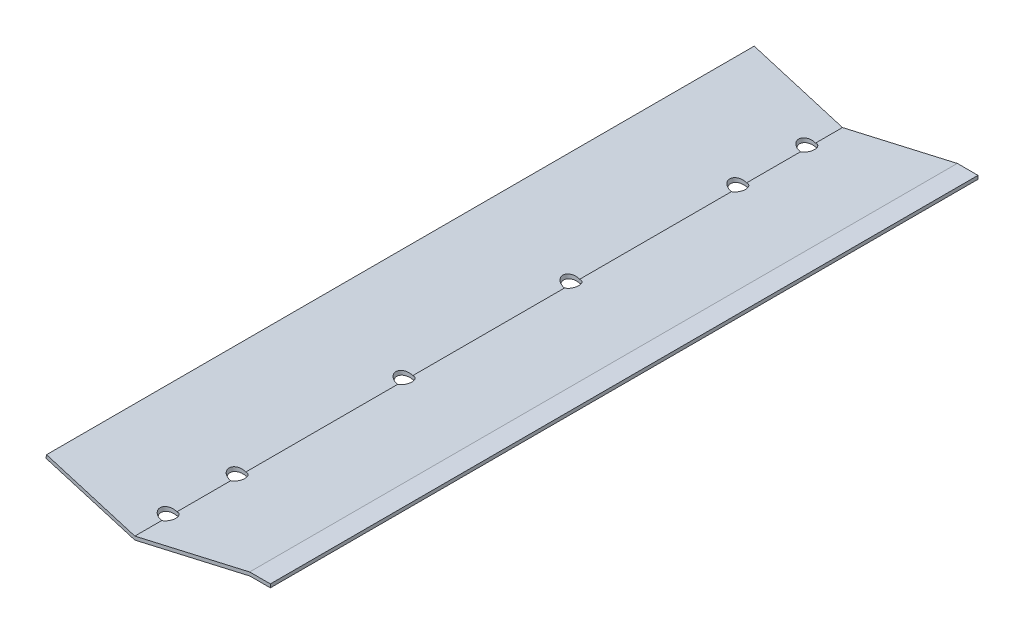
ISO-10303-21;
HEADER;
FILE_DESCRIPTION(('STEP AP214'),'2;1');
FILE_NAME('part.step','',(''),(''),'','','');
FILE_SCHEMA(('AUTOMOTIVE_DESIGN { 1 0 10303 214 1 1 1 1 }'));
ENDSEC;
DATA;
#1=APPLICATION_CONTEXT('core data for automotive mechanical design processes');
#2=APPLICATION_PROTOCOL_DEFINITION('international standard','automotive_design',2000,#1);
#3=PRODUCT_CONTEXT('',#1,'mechanical');
#4=PRODUCT('Part','Part','',(#3));
#5=PRODUCT_RELATED_PRODUCT_CATEGORY('part','',(#4));
#6=PRODUCT_DEFINITION_FORMATION('','',#4);
#7=PRODUCT_DEFINITION_CONTEXT('part definition',#1,'design');
#8=PRODUCT_DEFINITION('design','',#6,#7);
#9=PRODUCT_DEFINITION_SHAPE('','',#8);
#10=(LENGTH_UNIT() NAMED_UNIT(*) SI_UNIT(.MILLI.,.METRE.));
#11=(NAMED_UNIT(*) PLANE_ANGLE_UNIT() SI_UNIT($,.RADIAN.));
#12=(NAMED_UNIT(*) SI_UNIT($,.STERADIAN.) SOLID_ANGLE_UNIT());
#13=UNCERTAINTY_MEASURE_WITH_UNIT(LENGTH_MEASURE(1.E-05),#10,'distance_accuracy_value','');
#14=(GEOMETRIC_REPRESENTATION_CONTEXT(3) GLOBAL_UNCERTAINTY_ASSIGNED_CONTEXT((#13)) GLOBAL_UNIT_ASSIGNED_CONTEXT((#10,
#11,#12)) REPRESENTATION_CONTEXT('',''));
#15=CARTESIAN_POINT('',(0.,0.,0.));
#16=DIRECTION('',(0.,0.,1.));
#17=DIRECTION('',(1.,0.,0.));
#18=AXIS2_PLACEMENT_3D('',#15,#16,#17);
#19=CARTESIAN_POINT('',(-11425.3816093316,7351.86746050751,1026.));
#20=DIRECTION('',(-0.22352913665319,0.974697247901665,0.));
#21=DIRECTION('',(-0.974697247901665,-0.22352913665319,0.));
#22=AXIS2_PLACEMENT_3D('',#19,#20,#21);
#23=PLANE('',#22);
#24=DIRECTION('',(0.,0.,-1.));
#25=VECTOR('',#24,1.);
#26=CARTESIAN_POINT('',(-11592.2884405251,7313.59040580309,1026.));
#27=LINE('',#26,#25);
#28=CARTESIAN_POINT('',(-11592.2884405251,7313.59040580309,139.000000000003));
#29=VERTEX_POINT('',#28);
#30=CARTESIAN_POINT('',(-11592.2884405251,7313.59040580309,60.9999999999983));
#31=VERTEX_POINT('',#30);
#32=EDGE_CURVE('E235',#29,#31,#27,.T.);
#33=ORIENTED_EDGE('',*,*,#32,.T.);
#34=CARTESIAN_POINT('',(-11592.2884405251,7313.59040580309,50.));
#35=DIRECTION('',(-0.22352913665319,0.974697247901665,0.));
#36=DIRECTION('',(-0.974697247901665,-0.22352913665319,0.));
#37=AXIS2_PLACEMENT_3D('',#34,#35,#36);
#38=CIRCLE('',#37,10.9999999999978);
#39=CARTESIAN_POINT('',(-11592.2884405251,7313.59040580309,39.0000000000027));
#40=VERTEX_POINT('',#39);
#41=EDGE_CURVE('E427',#31,#40,#38,.T.);
#42=ORIENTED_EDGE('',*,*,#41,.T.);
#43=CARTESIAN_POINT('',(-11592.2884405251,7313.59040580309,0.));
#44=VERTEX_POINT('',#43);
#45=EDGE_CURVE('E196',#40,#44,#27,.T.);
#46=ORIENTED_EDGE('',*,*,#45,.T.);
#47=DIRECTION('',(0.974697247901665,0.22352913665319,0.));
#48=VECTOR('',#47,1.);
#49=CARTESIAN_POINT('',(-11425.3816093316,7351.86746050751,0.));
#50=LINE('',#49,#48);
#51=CARTESIAN_POINT('',(-11425.3816093316,7351.86746050751,0.));
#52=VERTEX_POINT('',#51);
#53=EDGE_CURVE('E255',#44,#52,#50,.T.);
#54=ORIENTED_EDGE('',*,*,#53,.T.);
#55=DIRECTION('',(0.,0.,-1.));
#56=VECTOR('',#55,1.);
#57=CARTESIAN_POINT('',(-11425.3816093316,7351.86746050751,1026.));
#58=LINE('',#57,#56);
#59=CARTESIAN_POINT('',(-11425.3816093316,7351.86746050751,1026.));
#60=VERTEX_POINT('',#59);
#61=EDGE_CURVE('E178',#60,#52,#58,.T.);
#62=ORIENTED_EDGE('',*,*,#61,.F.);
#63=DIRECTION('',(0.974697247901665,0.22352913665319,0.));
#64=VECTOR('',#63,1.);
#65=CARTESIAN_POINT('',(-11425.3816093316,7351.86746050751,1026.));
#66=LINE('',#65,#64);
#67=CARTESIAN_POINT('',(-11592.2884405251,7313.59040580309,1026.));
#68=VERTEX_POINT('',#67);
#69=EDGE_CURVE('E271',#68,#60,#66,.T.);
#70=ORIENTED_EDGE('',*,*,#69,.F.);
#71=CARTESIAN_POINT('',(-11592.2884405251,7313.59040580309,986.999999999998));
#72=VERTEX_POINT('',#71);
#73=EDGE_CURVE('E186',#68,#72,#27,.T.);
#74=ORIENTED_EDGE('',*,*,#73,.T.);
#75=CARTESIAN_POINT('',(-11592.2884405251,7313.59040580309,976.));
#76=DIRECTION('',(-0.22352913665319,0.974697247901665,0.));
#77=DIRECTION('',(-0.974697247901665,-0.22352913665319,0.));
#78=AXIS2_PLACEMENT_3D('',#75,#76,#77);
#79=CIRCLE('',#78,10.9999999999978);
#80=CARTESIAN_POINT('',(-11592.2884405251,7313.59040580309,965.000000000002));
#81=VERTEX_POINT('',#80);
#82=EDGE_CURVE('E172',#72,#81,#79,.T.);
#83=ORIENTED_EDGE('',*,*,#82,.T.);
#84=CARTESIAN_POINT('',(-11592.2884405251,7313.59040580309,886.999999999998));
#85=VERTEX_POINT('',#84);
#86=EDGE_CURVE('E184',#81,#85,#27,.T.);
#87=ORIENTED_EDGE('',*,*,#86,.T.);
#88=CARTESIAN_POINT('',(-11592.2884405251,7313.59040580309,876.));
#89=DIRECTION('',(-0.22352913665319,0.974697247901665,0.));
#90=DIRECTION('',(-0.974697247901665,-0.22352913665319,0.));
#91=AXIS2_PLACEMENT_3D('',#88,#89,#90);
#92=CIRCLE('',#91,10.9999999999978);
#93=CARTESIAN_POINT('',(-11592.2884405251,7313.59040580309,865.000000000002));
#94=VERTEX_POINT('',#93);
#95=EDGE_CURVE('E451',#85,#94,#92,.T.);
#96=ORIENTED_EDGE('',*,*,#95,.T.);
#97=CARTESIAN_POINT('',(-11592.2884405251,7313.59040580309,644.999999999998));
#98=VERTEX_POINT('',#97);
#99=EDGE_CURVE('E193',#94,#98,#27,.T.);
#100=ORIENTED_EDGE('',*,*,#99,.T.);
#101=CARTESIAN_POINT('',(-11592.2884405251,7313.59040580309,634.));
#102=DIRECTION('',(-0.22352913665319,0.974697247901665,0.));
#103=DIRECTION('',(-0.974697247901665,-0.22352913665319,0.));
#104=AXIS2_PLACEMENT_3D('',#101,#102,#103);
#105=CIRCLE('',#104,10.9999999999978);
#106=CARTESIAN_POINT('',(-11592.2884405251,7313.59040580309,623.000000000002));
#107=VERTEX_POINT('',#106);
#108=EDGE_CURVE('E445',#98,#107,#105,.T.);
#109=ORIENTED_EDGE('',*,*,#108,.T.);
#110=CARTESIAN_POINT('',(-11592.2884405251,7313.59040580309,402.999999999998));
#111=VERTEX_POINT('',#110);
#112=EDGE_CURVE('E198',#107,#111,#27,.T.);
#113=ORIENTED_EDGE('',*,*,#112,.T.);
#114=CARTESIAN_POINT('',(-11592.2884405251,7313.59040580309,392.));
#115=DIRECTION('',(-0.22352913665319,0.974697247901665,0.));
#116=DIRECTION('',(-0.974697247901665,-0.22352913665319,0.));
#117=AXIS2_PLACEMENT_3D('',#114,#115,#116);
#118=CIRCLE('',#117,10.9999999999978);
#119=CARTESIAN_POINT('',(-11592.2884405251,7313.59040580309,381.000000000003));
#120=VERTEX_POINT('',#119);
#121=EDGE_CURVE('E241',#111,#120,#118,.T.);
#122=ORIENTED_EDGE('',*,*,#121,.T.);
#123=CARTESIAN_POINT('',(-11592.2884405251,7313.59040580309,160.999999999998));
#124=VERTEX_POINT('',#123);
#125=EDGE_CURVE('E234',#120,#124,#27,.T.);
#126=ORIENTED_EDGE('',*,*,#125,.T.);
#127=CARTESIAN_POINT('',(-11592.2884405251,7313.59040580309,150.));
#128=DIRECTION('',(-0.22352913665319,0.974697247901665,0.));
#129=DIRECTION('',(-0.974697247901665,-0.22352913665319,0.));
#130=AXIS2_PLACEMENT_3D('',#127,#128,#129);
#131=CIRCLE('',#130,10.9999999999978);
#132=EDGE_CURVE('E239',#124,#29,#131,.T.);
#133=ORIENTED_EDGE('',*,*,#132,.T.);
#134=EDGE_LOOP('',(#33,#42,#46,#54,#62,#70,#74,#83,#87,#96,#100,#109,#113,#122,#126,#133));
#135=FACE_BOUND('',#134,.T.);
#136=ADVANCED_FACE('F33',(#135),#23,.F.);
#137=CARTESIAN_POINT('',(-11395.7884405248,7351.86746050751,1026.));
#138=DIRECTION('',(0.,1.,0.));
#139=DIRECTION('',(0.,0.,1.));
#140=AXIS2_PLACEMENT_3D('',#137,#138,#139);
#141=PLANE('',#140);
#142=DIRECTION('',(1.,0.,0.));
#143=VECTOR('',#142,1.);
#144=CARTESIAN_POINT('',(-11395.7884405248,7351.86746050751,0.));
#145=LINE('',#144,#143);
#146=CARTESIAN_POINT('',(-11395.7884405248,7351.86746050751,0.));
#147=VERTEX_POINT('',#146);
#148=EDGE_CURVE('E257',#52,#147,#145,.T.);
#149=ORIENTED_EDGE('',*,*,#148,.T.);
#150=DIRECTION('',(0.,0.,-1.));
#151=VECTOR('',#150,1.);
#152=CARTESIAN_POINT('',(-11395.7884405248,7351.86746050751,1026.));
#153=LINE('',#152,#151);
#154=CARTESIAN_POINT('',(-11395.7884405248,7351.86746050751,1026.));
#155=VERTEX_POINT('',#154);
#156=EDGE_CURVE('E219',#155,#147,#153,.T.);
#157=ORIENTED_EDGE('',*,*,#156,.F.);
#158=DIRECTION('',(1.,0.,0.));
#159=VECTOR('',#158,1.);
#160=CARTESIAN_POINT('',(-11395.7884405248,7351.86746050751,1026.));
#161=LINE('',#160,#159);
#162=EDGE_CURVE('E274',#60,#155,#161,.T.);
#163=ORIENTED_EDGE('',*,*,#162,.F.);
#164=ORIENTED_EDGE('',*,*,#61,.T.);
#165=EDGE_LOOP('',(#149,#157,#163,#164));
#166=FACE_BOUND('',#165,.T.);
#167=ADVANCED_FACE('F298',(#166),#141,.F.);
#168=CARTESIAN_POINT('',(-11395.7884405248,7356.86746050752,1026.));
#169=DIRECTION('',(-1.,7.10542735759105E-13,0.));
#170=DIRECTION('',(-7.10542735759105E-13,-1.,0.));
#171=AXIS2_PLACEMENT_3D('',#168,#169,#170);
#172=PLANE('',#171);
#173=DIRECTION('',(7.10542735759106E-13,1.,0.));
#174=VECTOR('',#173,1.);
#175=CARTESIAN_POINT('',(-11395.7884405248,7356.86746050752,0.));
#176=LINE('',#175,#174);
#177=CARTESIAN_POINT('',(-11395.7884405248,7356.86746050752,0.));
#178=VERTEX_POINT('',#177);
#179=EDGE_CURVE('E259',#147,#178,#176,.T.);
#180=ORIENTED_EDGE('',*,*,#179,.T.);
#181=DIRECTION('',(0.,0.,-1.));
#182=VECTOR('',#181,1.);
#183=CARTESIAN_POINT('',(-11395.7884405248,7356.86746050752,1026.));
#184=LINE('',#183,#182);
#185=CARTESIAN_POINT('',(-11395.7884405248,7356.86746050752,1026.));
#186=VERTEX_POINT('',#185);
#187=EDGE_CURVE('E216',#186,#178,#184,.T.);
#188=ORIENTED_EDGE('',*,*,#187,.F.);
#189=DIRECTION('',(7.10542735759106E-13,1.,0.));
#190=VECTOR('',#189,1.);
#191=CARTESIAN_POINT('',(-11395.7884405248,7356.86746050752,1026.));
#192=LINE('',#191,#190);
#193=EDGE_CURVE('E277',#155,#186,#192,.T.);
#194=ORIENTED_EDGE('',*,*,#193,.F.);
#195=ORIENTED_EDGE('',*,*,#156,.T.);
#196=EDGE_LOOP('',(#180,#188,#194,#195));
#197=FACE_BOUND('',#196,.T.);
#198=ADVANCED_FACE('F305',(#197),#172,.F.);
#199=CARTESIAN_POINT('',(-11425.7884405249,7356.86746050752,1026.));
#200=DIRECTION('',(0.,-1.,0.));
#201=DIRECTION('',(0.,0.,-1.));
#202=AXIS2_PLACEMENT_3D('',#199,#200,#201);
#203=PLANE('',#202);
#204=DIRECTION('',(-1.,0.,0.));
#205=VECTOR('',#204,1.);
#206=CARTESIAN_POINT('',(-11425.7884405249,7356.86746050752,0.));
#207=LINE('',#206,#205);
#208=CARTESIAN_POINT('',(-11425.7884405249,7356.86746050752,0.));
#209=VERTEX_POINT('',#208);
#210=EDGE_CURVE('E261',#178,#209,#207,.T.);
#211=ORIENTED_EDGE('',*,*,#210,.T.);
#212=DIRECTION('',(0.,0.,-1.));
#213=VECTOR('',#212,1.);
#214=CARTESIAN_POINT('',(-11425.7884405249,7356.86746050752,1026.));
#215=LINE('',#214,#213);
#216=CARTESIAN_POINT('',(-11425.7884405249,7356.86746050752,1026.));
#217=VERTEX_POINT('',#216);
#218=EDGE_CURVE('E212',#217,#209,#215,.T.);
#219=ORIENTED_EDGE('',*,*,#218,.F.);
#220=DIRECTION('',(-1.,0.,0.));
#221=VECTOR('',#220,1.);
#222=CARTESIAN_POINT('',(-11425.7884405249,7356.86746050752,1026.));
#223=LINE('',#222,#221);
#224=EDGE_CURVE('E283',#186,#217,#223,.T.);
#225=ORIENTED_EDGE('',*,*,#224,.F.);
#226=ORIENTED_EDGE('',*,*,#187,.T.);
#227=EDGE_LOOP('',(#211,#219,#225,#226));
#228=FACE_BOUND('',#227,.T.);
#229=ADVANCED_FACE('F309',(#228),#203,.F.);
#230=CARTESIAN_POINT('',(-11592.2884405251,7318.65705167767,1026.));
#231=DIRECTION('',(0.223677363270568,-0.97466324295129,0.));
#232=DIRECTION('',(0.97466324295129,0.223677363270568,0.));
#233=AXIS2_PLACEMENT_3D('',#230,#231,#232);
#234=PLANE('',#233);
#235=DIRECTION('',(0.,0.,-1.));
#236=VECTOR('',#235,1.);
#237=CARTESIAN_POINT('',(-11592.2884405251,7318.65705167767,1026.));
#238=LINE('',#237,#236);
#239=CARTESIAN_POINT('',(-11592.2884405251,7318.65705167767,39.0584577685423));
#240=VERTEX_POINT('',#239);
#241=CARTESIAN_POINT('',(-11592.2884405251,7318.65705167767,0.));
#242=VERTEX_POINT('',#241);
#243=EDGE_CURVE('E208',#240,#242,#238,.T.);
#244=ORIENTED_EDGE('',*,*,#243,.F.);
#245=CARTESIAN_POINT('',(-11593.3922885496,7318.40372744762,50.));
#246=DIRECTION('',(0.223677363270568,-0.97466324295129,0.));
#247=DIRECTION('',(-0.97466324295129,-0.223677363270568,0.));
#248=AXIS2_PLACEMENT_3D('',#245,#246,#247);
#249=ELLIPSE('',#248,11.0000001271989,10.9999999999978);
#250=CARTESIAN_POINT('',(-11592.2884405251,7318.65705167767,60.9415422314578));
#251=VERTEX_POINT('',#250);
#252=EDGE_CURVE('E46',#240,#251,#249,.T.);
#253=ORIENTED_EDGE('',*,*,#252,.T.);
#254=CARTESIAN_POINT('',(-11592.2884405251,7318.65705167767,139.058457768542));
#255=VERTEX_POINT('',#254);
#256=EDGE_CURVE('E333',#255,#251,#238,.T.);
#257=ORIENTED_EDGE('',*,*,#256,.F.);
#258=CARTESIAN_POINT('',(-11593.3922885496,7318.40372744762,150.));
#259=DIRECTION('',(0.223677363270568,-0.97466324295129,0.));
#260=DIRECTION('',(-0.97466324295129,-0.223677363270568,0.));
#261=AXIS2_PLACEMENT_3D('',#258,#259,#260);
#262=ELLIPSE('',#261,11.0000001271989,10.9999999999978);
#263=CARTESIAN_POINT('',(-11592.2884405251,7318.65705167767,160.941542231458));
#264=VERTEX_POINT('',#263);
#265=EDGE_CURVE('E53',#255,#264,#262,.T.);
#266=ORIENTED_EDGE('',*,*,#265,.T.);
#267=CARTESIAN_POINT('',(-11592.2884405251,7318.65705167767,381.058457768542));
#268=VERTEX_POINT('',#267);
#269=EDGE_CURVE('E329',#268,#264,#238,.T.);
#270=ORIENTED_EDGE('',*,*,#269,.F.);
#271=CARTESIAN_POINT('',(-11593.3922885496,7318.40372744762,392.));
#272=DIRECTION('',(0.223677363270568,-0.97466324295129,0.));
#273=DIRECTION('',(-0.97466324295129,-0.223677363270568,0.));
#274=AXIS2_PLACEMENT_3D('',#271,#272,#273);
#275=ELLIPSE('',#274,11.0000001271989,10.9999999999978);
#276=CARTESIAN_POINT('',(-11592.2884405251,7318.65705167767,402.941542231458));
#277=VERTEX_POINT('',#276);
#278=EDGE_CURVE('E435',#268,#277,#275,.T.);
#279=ORIENTED_EDGE('',*,*,#278,.T.);
#280=CARTESIAN_POINT('',(-11592.2884405251,7318.65705167767,623.058457768542));
#281=VERTEX_POINT('',#280);
#282=EDGE_CURVE('E326',#281,#277,#238,.T.);
#283=ORIENTED_EDGE('',*,*,#282,.F.);
#284=CARTESIAN_POINT('',(-11593.3922885496,7318.40372744762,634.));
#285=DIRECTION('',(0.223677363270568,-0.97466324295129,0.));
#286=DIRECTION('',(-0.97466324295129,-0.223677363270568,0.));
#287=AXIS2_PLACEMENT_3D('',#284,#285,#286);
#288=ELLIPSE('',#287,11.0000001271989,10.9999999999978);
#289=CARTESIAN_POINT('',(-11592.2884405251,7318.65705167767,644.941542231458));
#290=VERTEX_POINT('',#289);
#291=EDGE_CURVE('E440',#281,#290,#288,.T.);
#292=ORIENTED_EDGE('',*,*,#291,.T.);
#293=CARTESIAN_POINT('',(-11592.2884405251,7318.65705167767,865.058457768542));
#294=VERTEX_POINT('',#293);
#295=EDGE_CURVE('E324',#294,#290,#238,.T.);
#296=ORIENTED_EDGE('',*,*,#295,.F.);
#297=CARTESIAN_POINT('',(-11593.3922885496,7318.40372744762,876.));
#298=DIRECTION('',(0.223677363270568,-0.97466324295129,0.));
#299=DIRECTION('',(-0.97466324295129,-0.223677363270568,0.));
#300=AXIS2_PLACEMENT_3D('',#297,#298,#299);
#301=ELLIPSE('',#300,11.0000001271989,10.9999999999978);
#302=CARTESIAN_POINT('',(-11592.2884405251,7318.65705167767,886.941542231458));
#303=VERTEX_POINT('',#302);
#304=EDGE_CURVE('E323',#294,#303,#301,.T.);
#305=ORIENTED_EDGE('',*,*,#304,.T.);
#306=CARTESIAN_POINT('',(-11592.2884405251,7318.65705167767,965.058457768542));
#307=VERTEX_POINT('',#306);
#308=EDGE_CURVE('E213',#307,#303,#238,.T.);
#309=ORIENTED_EDGE('',*,*,#308,.F.);
#310=CARTESIAN_POINT('',(-11593.3922885496,7318.40372744762,976.));
#311=DIRECTION('',(0.223677363270568,-0.97466324295129,0.));
#312=DIRECTION('',(-0.97466324295129,-0.223677363270568,0.));
#313=AXIS2_PLACEMENT_3D('',#310,#311,#312);
#314=ELLIPSE('',#313,11.0000001271989,10.9999999999978);
#315=CARTESIAN_POINT('',(-11592.2884405251,7318.65705167767,986.941542231458));
#316=VERTEX_POINT('',#315);
#317=EDGE_CURVE('E316',#307,#316,#314,.T.);
#318=ORIENTED_EDGE('',*,*,#317,.T.);
#319=CARTESIAN_POINT('',(-11592.2884405251,7318.65705167767,1026.));
#320=VERTEX_POINT('',#319);
#321=EDGE_CURVE('E209',#320,#316,#238,.T.);
#322=ORIENTED_EDGE('',*,*,#321,.F.);
#323=DIRECTION('',(-0.97466324295129,-0.223677363270568,0.));
#324=VECTOR('',#323,1.);
#325=CARTESIAN_POINT('',(-11592.2884405251,7318.65705167767,1026.));
#326=LINE('',#325,#324);
#327=EDGE_CURVE('E285',#217,#320,#326,.T.);
#328=ORIENTED_EDGE('',*,*,#327,.F.);
#329=ORIENTED_EDGE('',*,*,#218,.T.);
#330=DIRECTION('',(-0.97466324295129,-0.223677363270568,0.));
#331=VECTOR('',#330,1.);
#332=CARTESIAN_POINT('',(-11592.2884405251,7318.65705167767,0.));
#333=LINE('',#332,#331);
#334=EDGE_CURVE('E263',#209,#242,#333,.T.);
#335=ORIENTED_EDGE('',*,*,#334,.T.);
#336=EDGE_LOOP('',(#244,#253,#257,#266,#270,#279,#283,#292,#296,#305,#309,#318,#322,#328,#329,#335));
#337=FACE_BOUND('',#336,.T.);
#338=ADVANCED_FACE('F313',(#337),#234,.F.);
#339=CARTESIAN_POINT('',(-11720.2884405252,7356.86746050752,1026.));
#340=DIRECTION('',(-0.286045517850294,-0.958216030818603,0.));
#341=DIRECTION('',(0.958216030818603,-0.286045517850294,0.));
#342=AXIS2_PLACEMENT_3D('',#339,#340,#341);
#343=PLANE('',#342);
#344=ORIENTED_EDGE('',*,*,#256,.T.);
#345=CARTESIAN_POINT('',(-11593.535776323,7319.02940488695,50.));
#346=DIRECTION('',(-0.286045517850294,-0.958216030818603,0.));
#347=DIRECTION('',(0.958216030818603,-0.286045517850294,0.));
#348=AXIS2_PLACEMENT_3D('',#345,#346,#347);
#349=ELLIPSE('',#348,12.6432273574094,10.9999999999978);
#350=EDGE_CURVE('E336',#251,#240,#349,.T.);
#351=ORIENTED_EDGE('',*,*,#350,.T.);
#352=ORIENTED_EDGE('',*,*,#243,.T.);
#353=DIRECTION('',(-0.958216030818603,0.286045517850294,0.));
#354=VECTOR('',#353,1.);
#355=CARTESIAN_POINT('',(-11720.2884405252,7356.86746050752,0.));
#356=LINE('',#355,#354);
#357=CARTESIAN_POINT('',(-11720.2884405252,7356.86746050752,0.));
#358=VERTEX_POINT('',#357);
#359=EDGE_CURVE('E266',#242,#358,#356,.T.);
#360=ORIENTED_EDGE('',*,*,#359,.T.);
#361=DIRECTION('',(0.,0.,-1.));
#362=VECTOR('',#361,1.);
#363=CARTESIAN_POINT('',(-11720.2884405252,7356.86746050752,1026.));
#364=LINE('',#363,#362);
#365=CARTESIAN_POINT('',(-11720.2884405252,7356.86746050752,1026.));
#366=VERTEX_POINT('',#365);
#367=EDGE_CURVE('E205',#366,#358,#364,.T.);
#368=ORIENTED_EDGE('',*,*,#367,.F.);
#369=DIRECTION('',(-0.958216030818603,0.286045517850294,0.));
#370=VECTOR('',#369,1.);
#371=CARTESIAN_POINT('',(-11720.2884405252,7356.86746050752,1026.));
#372=LINE('',#371,#370);
#373=EDGE_CURVE('E251',#320,#366,#372,.T.);
#374=ORIENTED_EDGE('',*,*,#373,.F.);
#375=ORIENTED_EDGE('',*,*,#321,.T.);
#376=CARTESIAN_POINT('',(-11593.535776323,7319.02940488695,976.));
#377=DIRECTION('',(-0.286045517850294,-0.958216030818603,0.));
#378=DIRECTION('',(0.958216030818603,-0.286045517850294,0.));
#379=AXIS2_PLACEMENT_3D('',#376,#377,#378);
#380=ELLIPSE('',#379,12.6432273574094,10.9999999999978);
#381=EDGE_CURVE('E187',#316,#307,#380,.T.);
#382=ORIENTED_EDGE('',*,*,#381,.T.);
#383=ORIENTED_EDGE('',*,*,#308,.T.);
#384=CARTESIAN_POINT('',(-11593.535776323,7319.02940488695,876.));
#385=DIRECTION('',(-0.286045517850294,-0.958216030818603,0.));
#386=DIRECTION('',(0.958216030818603,-0.286045517850294,0.));
#387=AXIS2_PLACEMENT_3D('',#384,#385,#386);
#388=ELLIPSE('',#387,12.6432273574094,10.9999999999978);
#389=EDGE_CURVE('E449',#303,#294,#388,.T.);
#390=ORIENTED_EDGE('',*,*,#389,.T.);
#391=ORIENTED_EDGE('',*,*,#295,.T.);
#392=CARTESIAN_POINT('',(-11593.535776323,7319.02940488695,634.));
#393=DIRECTION('',(-0.286045517850294,-0.958216030818603,0.));
#394=DIRECTION('',(0.958216030818603,-0.286045517850294,0.));
#395=AXIS2_PLACEMENT_3D('',#392,#393,#394);
#396=ELLIPSE('',#395,12.6432273574094,10.9999999999978);
#397=EDGE_CURVE('E443',#290,#281,#396,.T.);
#398=ORIENTED_EDGE('',*,*,#397,.T.);
#399=ORIENTED_EDGE('',*,*,#282,.T.);
#400=CARTESIAN_POINT('',(-11593.535776323,7319.02940488695,392.));
#401=DIRECTION('',(-0.286045517850294,-0.958216030818603,0.));
#402=DIRECTION('',(0.958216030818603,-0.286045517850294,0.));
#403=AXIS2_PLACEMENT_3D('',#400,#401,#402);
#404=ELLIPSE('',#403,12.6432273574094,10.9999999999978);
#405=EDGE_CURVE('E437',#277,#268,#404,.T.);
#406=ORIENTED_EDGE('',*,*,#405,.T.);
#407=ORIENTED_EDGE('',*,*,#269,.T.);
#408=CARTESIAN_POINT('',(-11593.535776323,7319.02940488695,150.));
#409=DIRECTION('',(-0.286045517850294,-0.958216030818603,0.));
#410=DIRECTION('',(0.958216030818603,-0.286045517850294,0.));
#411=AXIS2_PLACEMENT_3D('',#408,#409,#410);
#412=ELLIPSE('',#411,12.6432273574094,10.9999999999978);
#413=EDGE_CURVE('E429',#264,#255,#412,.T.);
#414=ORIENTED_EDGE('',*,*,#413,.T.);
#415=EDGE_LOOP('',(#344,#351,#352,#360,#368,#374,#375,#382,#383,#390,#391,#398,#399,#406,#407,#414));
#416=FACE_BOUND('',#415,.T.);
#417=ADVANCED_FACE('F294',(#416),#343,.F.);
#418=CARTESIAN_POINT('',(-11721.0967515172,7351.93322973258,1026.));
#419=DIRECTION('',(0.986846154986232,-0.161662198391862,0.));
#420=DIRECTION('',(0.161662198391862,0.986846154986232,0.));
#421=AXIS2_PLACEMENT_3D('',#418,#419,#420);
#422=PLANE('',#421);
#423=DIRECTION('',(-0.161662198391862,-0.986846154986232,0.));
#424=VECTOR('',#423,1.);
#425=CARTESIAN_POINT('',(-11721.0967515172,7351.93322973258,0.));
#426=LINE('',#425,#424);
#427=CARTESIAN_POINT('',(-11721.0967515172,7351.93322973258,0.));
#428=VERTEX_POINT('',#427);
#429=EDGE_CURVE('E267',#358,#428,#426,.T.);
#430=ORIENTED_EDGE('',*,*,#429,.T.);
#431=DIRECTION('',(0.,0.,-1.));
#432=VECTOR('',#431,1.);
#433=CARTESIAN_POINT('',(-11721.0967515172,7351.93322973258,1026.));
#434=LINE('',#433,#432);
#435=CARTESIAN_POINT('',(-11721.0967515172,7351.93322973258,1026.));
#436=VERTEX_POINT('',#435);
#437=EDGE_CURVE('E195',#436,#428,#434,.T.);
#438=ORIENTED_EDGE('',*,*,#437,.F.);
#439=DIRECTION('',(-0.161662198391862,-0.986846154986232,0.));
#440=VECTOR('',#439,1.);
#441=CARTESIAN_POINT('',(-11721.0967515172,7351.93322973258,1026.));
#442=LINE('',#441,#440);
#443=EDGE_CURVE('E246',#366,#436,#442,.T.);
#444=ORIENTED_EDGE('',*,*,#443,.F.);
#445=ORIENTED_EDGE('',*,*,#367,.T.);
#446=EDGE_LOOP('',(#430,#438,#444,#445));
#447=FACE_BOUND('',#446,.T.);
#448=ADVANCED_FACE('F296',(#447),#422,.F.);
#449=CARTESIAN_POINT('',(-11592.2884405251,7313.59040580309,1026.));
#450=DIRECTION('',(0.285301558670729,0.958437802165614,0.));
#451=DIRECTION('',(-0.958437802165614,0.285301558670729,0.));
#452=AXIS2_PLACEMENT_3D('',#449,#450,#451);
#453=PLANE('',#452);
#454=ORIENTED_EDGE('',*,*,#45,.F.);
#455=CARTESIAN_POINT('',(-11592.2884405251,7313.59040580309,50.));
#456=DIRECTION('',(0.285301558670729,0.958437802165614,0.));
#457=DIRECTION('',(0.958437802165614,-0.285301558670729,0.));
#458=AXIS2_PLACEMENT_3D('',#455,#456,#457);
#459=ELLIPSE('',#458,12.637671969893,10.9999999999978);
#460=EDGE_CURVE('E11',#40,#31,#459,.T.);
#461=ORIENTED_EDGE('',*,*,#460,.T.);
#462=ORIENTED_EDGE('',*,*,#32,.F.);
#463=CARTESIAN_POINT('',(-11592.2884405251,7313.59040580309,150.));
#464=DIRECTION('',(0.285301558670729,0.958437802165614,0.));
#465=DIRECTION('',(0.958437802165614,-0.285301558670729,0.));
#466=AXIS2_PLACEMENT_3D('',#463,#464,#465);
#467=ELLIPSE('',#466,12.637671969893,10.9999999999978);
#468=EDGE_CURVE('E40',#29,#124,#467,.T.);
#469=ORIENTED_EDGE('',*,*,#468,.T.);
#470=ORIENTED_EDGE('',*,*,#125,.F.);
#471=CARTESIAN_POINT('',(-11592.2884405251,7313.59040580309,392.));
#472=DIRECTION('',(0.285301558670729,0.958437802165614,0.));
#473=DIRECTION('',(0.958437802165614,-0.285301558670729,0.));
#474=AXIS2_PLACEMENT_3D('',#471,#472,#473);
#475=ELLIPSE('',#474,12.637671969893,10.9999999999978);
#476=EDGE_CURVE('E228',#120,#111,#475,.T.);
#477=ORIENTED_EDGE('',*,*,#476,.T.);
#478=ORIENTED_EDGE('',*,*,#112,.F.);
#479=CARTESIAN_POINT('',(-11592.2884405251,7313.59040580309,634.));
#480=DIRECTION('',(0.285301558670729,0.958437802165614,0.));
#481=DIRECTION('',(0.958437802165614,-0.285301558670729,0.));
#482=AXIS2_PLACEMENT_3D('',#479,#480,#481);
#483=ELLIPSE('',#482,12.637671969893,10.9999999999978);
#484=EDGE_CURVE('E225',#107,#98,#483,.T.);
#485=ORIENTED_EDGE('',*,*,#484,.T.);
#486=ORIENTED_EDGE('',*,*,#99,.F.);
#487=CARTESIAN_POINT('',(-11592.2884405251,7313.59040580309,876.));
#488=DIRECTION('',(0.285301558670729,0.958437802165614,0.));
#489=DIRECTION('',(0.958437802165614,-0.285301558670729,0.));
#490=AXIS2_PLACEMENT_3D('',#487,#488,#489);
#491=ELLIPSE('',#490,12.637671969893,10.9999999999978);
#492=EDGE_CURVE('E177',#94,#85,#491,.T.);
#493=ORIENTED_EDGE('',*,*,#492,.T.);
#494=ORIENTED_EDGE('',*,*,#86,.F.);
#495=CARTESIAN_POINT('',(-11592.2884405251,7313.59040580309,976.));
#496=DIRECTION('',(0.285301558670729,0.958437802165614,0.));
#497=DIRECTION('',(0.958437802165614,-0.285301558670729,0.));
#498=AXIS2_PLACEMENT_3D('',#495,#496,#497);
#499=ELLIPSE('',#498,12.637671969893,10.9999999999978);
#500=EDGE_CURVE('E168',#81,#72,#499,.T.);
#501=ORIENTED_EDGE('',*,*,#500,.T.);
#502=ORIENTED_EDGE('',*,*,#73,.F.);
#503=DIRECTION('',(0.958437802165614,-0.285301558670729,0.));
#504=VECTOR('',#503,1.);
#505=CARTESIAN_POINT('',(-11592.2884405251,7313.59040580309,1026.));
#506=LINE('',#505,#504);
#507=EDGE_CURVE('E243',#436,#68,#506,.T.);
#508=ORIENTED_EDGE('',*,*,#507,.F.);
#509=ORIENTED_EDGE('',*,*,#437,.T.);
#510=DIRECTION('',(0.958437802165614,-0.285301558670729,0.));
#511=VECTOR('',#510,1.);
#512=CARTESIAN_POINT('',(-11592.2884405251,7313.59040580309,0.));
#513=LINE('',#512,#511);
#514=EDGE_CURVE('E201',#428,#44,#513,.T.);
#515=ORIENTED_EDGE('',*,*,#514,.T.);
#516=EDGE_LOOP('',(#454,#461,#462,#469,#470,#477,#478,#485,#486,#493,#494,#501,#502,#508,#509,#515));
#517=FACE_BOUND('',#516,.T.);
#518=ADVANCED_FACE('F191',(#517),#453,.F.);
#519=CARTESIAN_POINT('',(0.,0.,1026.));
#520=DIRECTION('',(0.,0.,1.));
#521=DIRECTION('',(1.,0.,0.));
#522=AXIS2_PLACEMENT_3D('',#519,#520,#521);
#523=PLANE('',#522);
#524=ORIENTED_EDGE('',*,*,#69,.T.);
#525=ORIENTED_EDGE('',*,*,#162,.T.);
#526=ORIENTED_EDGE('',*,*,#193,.T.);
#527=ORIENTED_EDGE('',*,*,#224,.T.);
#528=ORIENTED_EDGE('',*,*,#327,.T.);
#529=ORIENTED_EDGE('',*,*,#373,.T.);
#530=ORIENTED_EDGE('',*,*,#443,.T.);
#531=ORIENTED_EDGE('',*,*,#507,.T.);
#532=EDGE_LOOP('',(#524,#525,#526,#527,#528,#529,#530,#531));
#533=FACE_BOUND('',#532,.T.);
#534=ADVANCED_FACE('F288',(#533),#523,.T.);
#535=CARTESIAN_POINT('',(0.,0.,0.));
#536=DIRECTION('',(0.,0.,1.));
#537=DIRECTION('',(1.,0.,0.));
#538=AXIS2_PLACEMENT_3D('',#535,#536,#537);
#539=PLANE('',#538);
#540=ORIENTED_EDGE('',*,*,#53,.F.);
#541=ORIENTED_EDGE('',*,*,#514,.F.);
#542=ORIENTED_EDGE('',*,*,#429,.F.);
#543=ORIENTED_EDGE('',*,*,#359,.F.);
#544=ORIENTED_EDGE('',*,*,#334,.F.);
#545=ORIENTED_EDGE('',*,*,#210,.F.);
#546=ORIENTED_EDGE('',*,*,#179,.F.);
#547=ORIENTED_EDGE('',*,*,#148,.F.);
#548=EDGE_LOOP('',(#540,#541,#542,#543,#544,#545,#546,#547));
#549=FACE_BOUND('',#548,.T.);
#550=ADVANCED_FACE('F338',(#549),#539,.F.);
#551=CARTESIAN_POINT('',(-11608.1532950778,7382.7689938943,976.));
#552=DIRECTION('',(0.22352913665319,-0.974697247901665,0.));
#553=DIRECTION('',(0.974697247901665,0.22352913665319,0.));
#554=AXIS2_PLACEMENT_3D('',#551,#552,#553);
#555=CYLINDRICAL_SURFACE('',#554,10.9999999999978);
#556=ORIENTED_EDGE('',*,*,#500,.F.);
#557=ORIENTED_EDGE('',*,*,#82,.F.);
#558=EDGE_LOOP('',(#556,#557));
#559=FACE_BOUND('',#558,.T.);
#560=ORIENTED_EDGE('',*,*,#381,.F.);
#561=ORIENTED_EDGE('',*,*,#317,.F.);
#562=EDGE_LOOP('',(#560,#561));
#563=FACE_BOUND('',#562,.T.);
#564=ADVANCED_FACE('F170',(#559,#563),#555,.F.);
#565=CARTESIAN_POINT('',(-11608.1532950778,7382.7689938943,876.));
#566=DIRECTION('',(0.22352913665319,-0.974697247901665,0.));
#567=DIRECTION('',(0.974697247901665,0.22352913665319,0.));
#568=AXIS2_PLACEMENT_3D('',#565,#566,#567);
#569=CYLINDRICAL_SURFACE('',#568,10.9999999999978);
#570=ORIENTED_EDGE('',*,*,#492,.F.);
#571=ORIENTED_EDGE('',*,*,#95,.F.);
#572=EDGE_LOOP('',(#570,#571));
#573=FACE_BOUND('',#572,.T.);
#574=ORIENTED_EDGE('',*,*,#389,.F.);
#575=ORIENTED_EDGE('',*,*,#304,.F.);
#576=EDGE_LOOP('',(#574,#575));
#577=FACE_BOUND('',#576,.T.);
#578=ADVANCED_FACE('F345',(#573,#577),#569,.F.);
#579=CARTESIAN_POINT('',(-11608.1532950778,7382.7689938943,634.));
#580=DIRECTION('',(0.22352913665319,-0.974697247901665,0.));
#581=DIRECTION('',(0.974697247901665,0.22352913665319,0.));
#582=AXIS2_PLACEMENT_3D('',#579,#580,#581);
#583=CYLINDRICAL_SURFACE('',#582,10.9999999999978);
#584=ORIENTED_EDGE('',*,*,#484,.F.);
#585=ORIENTED_EDGE('',*,*,#108,.F.);
#586=EDGE_LOOP('',(#584,#585));
#587=FACE_BOUND('',#586,.T.);
#588=ORIENTED_EDGE('',*,*,#397,.F.);
#589=ORIENTED_EDGE('',*,*,#291,.F.);
#590=EDGE_LOOP('',(#588,#589));
#591=FACE_BOUND('',#590,.T.);
#592=ADVANCED_FACE('F384',(#587,#591),#583,.F.);
#593=CARTESIAN_POINT('',(-11608.1532950778,7382.7689938943,392.));
#594=DIRECTION('',(0.22352913665319,-0.974697247901665,0.));
#595=DIRECTION('',(0.974697247901665,0.22352913665319,0.));
#596=AXIS2_PLACEMENT_3D('',#593,#594,#595);
#597=CYLINDRICAL_SURFACE('',#596,10.9999999999978);
#598=ORIENTED_EDGE('',*,*,#476,.F.);
#599=ORIENTED_EDGE('',*,*,#121,.F.);
#600=EDGE_LOOP('',(#598,#599));
#601=FACE_BOUND('',#600,.T.);
#602=ORIENTED_EDGE('',*,*,#405,.F.);
#603=ORIENTED_EDGE('',*,*,#278,.F.);
#604=EDGE_LOOP('',(#602,#603));
#605=FACE_BOUND('',#604,.T.);
#606=ADVANCED_FACE('F394',(#601,#605),#597,.F.);
#607=CARTESIAN_POINT('',(-11608.1532950778,7382.7689938943,150.));
#608=DIRECTION('',(0.22352913665319,-0.974697247901665,0.));
#609=DIRECTION('',(0.974697247901665,0.22352913665319,0.));
#610=AXIS2_PLACEMENT_3D('',#607,#608,#609);
#611=CYLINDRICAL_SURFACE('',#610,10.9999999999978);
#612=ORIENTED_EDGE('',*,*,#468,.F.);
#613=ORIENTED_EDGE('',*,*,#132,.F.);
#614=EDGE_LOOP('',(#612,#613));
#615=FACE_BOUND('',#614,.T.);
#616=ORIENTED_EDGE('',*,*,#413,.F.);
#617=ORIENTED_EDGE('',*,*,#265,.F.);
#618=EDGE_LOOP('',(#616,#617));
#619=FACE_BOUND('',#618,.T.);
#620=ADVANCED_FACE('F404',(#615,#619),#611,.F.);
#621=CARTESIAN_POINT('',(-11608.1532950778,7382.7689938943,50.));
#622=DIRECTION('',(0.22352913665319,-0.974697247901665,0.));
#623=DIRECTION('',(0.974697247901665,0.22352913665319,0.));
#624=AXIS2_PLACEMENT_3D('',#621,#622,#623);
#625=CYLINDRICAL_SURFACE('',#624,10.9999999999978);
#626=ORIENTED_EDGE('',*,*,#460,.F.);
#627=ORIENTED_EDGE('',*,*,#41,.F.);
#628=EDGE_LOOP('',(#626,#627));
#629=FACE_BOUND('',#628,.T.);
#630=ORIENTED_EDGE('',*,*,#350,.F.);
#631=ORIENTED_EDGE('',*,*,#252,.F.);
#632=EDGE_LOOP('',(#630,#631));
#633=FACE_BOUND('',#632,.T.);
#634=ADVANCED_FACE('F414',(#629,#633),#625,.F.);
#635=CLOSED_SHELL('',(#136,#167,#198,#229,#338,#417,#448,#518,#534,#550,#564,#578,#592,#606,
#620,#634));
#636=MANIFOLD_SOLID_BREP('B2',#635);
#637=ADVANCED_BREP_SHAPE_REPRESENTATION('',(#18,#636),#14);
#638=SHAPE_DEFINITION_REPRESENTATION(#9,#637);
ENDSEC;
END-ISO-10303-21;
